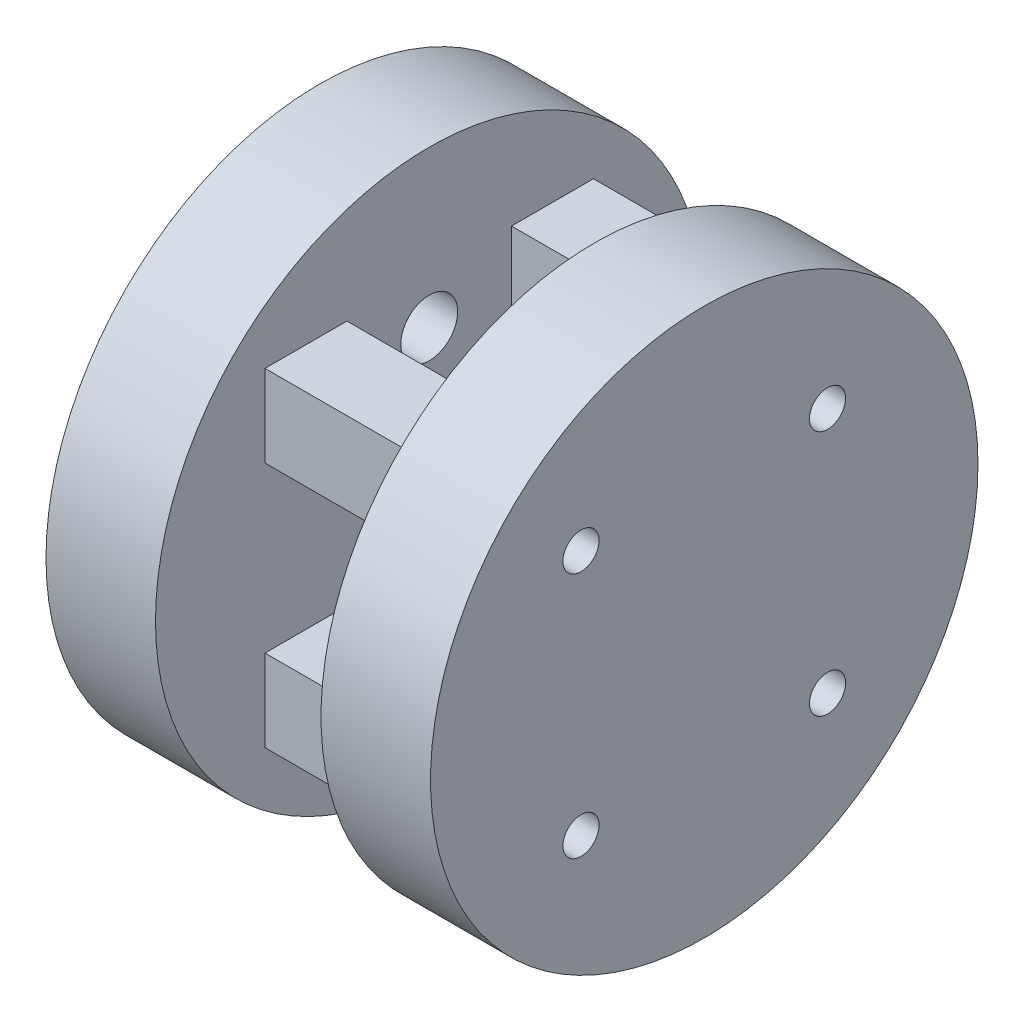
ISO-10303-21;
HEADER;
FILE_DESCRIPTION(('STEP AP214'),'2;1');
FILE_NAME('part.step','',(''),(''),'','','');
FILE_SCHEMA(('AUTOMOTIVE_DESIGN { 1 0 10303 214 1 1 1 1 }'));
ENDSEC;
DATA;
#1=APPLICATION_CONTEXT('core data for automotive mechanical design processes');
#2=APPLICATION_PROTOCOL_DEFINITION('international standard','automotive_design',2000,#1);
#3=PRODUCT_CONTEXT('',#1,'mechanical');
#4=PRODUCT('Part','Part','',(#3));
#5=PRODUCT_RELATED_PRODUCT_CATEGORY('part','',(#4));
#6=PRODUCT_DEFINITION_FORMATION('','',#4);
#7=PRODUCT_DEFINITION_CONTEXT('part definition',#1,'design');
#8=PRODUCT_DEFINITION('design','',#6,#7);
#9=PRODUCT_DEFINITION_SHAPE('','',#8);
#10=(LENGTH_UNIT() NAMED_UNIT(*) SI_UNIT(.MILLI.,.METRE.));
#11=(NAMED_UNIT(*) PLANE_ANGLE_UNIT() SI_UNIT($,.RADIAN.));
#12=(NAMED_UNIT(*) SI_UNIT($,.STERADIAN.) SOLID_ANGLE_UNIT());
#13=UNCERTAINTY_MEASURE_WITH_UNIT(LENGTH_MEASURE(1.E-05),#10,'distance_accuracy_value','');
#14=(GEOMETRIC_REPRESENTATION_CONTEXT(3) GLOBAL_UNCERTAINTY_ASSIGNED_CONTEXT((#13)) GLOBAL_UNIT_ASSIGNED_CONTEXT((#10,
#11,#12)) REPRESENTATION_CONTEXT('',''));
#15=CARTESIAN_POINT('',(0.,0.,0.));
#16=DIRECTION('',(0.,0.,1.));
#17=DIRECTION('',(1.,0.,0.));
#18=AXIS2_PLACEMENT_3D('',#15,#16,#17);
#19=CARTESIAN_POINT('',(35.12,0.,0.));
#20=DIRECTION('',(-1.,0.,0.));
#21=DIRECTION('',(0.,0.,1.));
#22=AXIS2_PLACEMENT_3D('',#19,#20,#21);
#23=CYLINDRICAL_SURFACE('',#22,25.);
#24=CARTESIAN_POINT('',(35.12,0.,0.));
#25=DIRECTION('',(1.,0.,0.));
#26=DIRECTION('',(0.,0.,-1.));
#27=AXIS2_PLACEMENT_3D('',#24,#25,#26);
#28=CIRCLE('',#27,25.);
#29=CARTESIAN_POINT('',(35.12,0.,-25.));
#30=VERTEX_POINT('',#29);
#31=EDGE_CURVE('E11',#30,#30,#28,.T.);
#32=ORIENTED_EDGE('',*,*,#31,.F.);
#33=EDGE_LOOP('',(#32));
#34=FACE_BOUND('',#33,.T.);
#35=CARTESIAN_POINT('',(25.12,0.,0.));
#36=DIRECTION('',(1.,0.,0.));
#37=DIRECTION('',(0.,0.,-1.));
#38=AXIS2_PLACEMENT_3D('',#35,#36,#37);
#39=CIRCLE('',#38,25.);
#40=CARTESIAN_POINT('',(25.12,0.,-25.));
#41=VERTEX_POINT('',#40);
#42=EDGE_CURVE('E62',#41,#41,#39,.T.);
#43=ORIENTED_EDGE('',*,*,#42,.T.);
#44=EDGE_LOOP('',(#43));
#45=FACE_BOUND('',#44,.T.);
#46=ADVANCED_FACE('F55',(#34,#45),#23,.T.);
#47=CARTESIAN_POINT('',(35.12,0.,0.));
#48=DIRECTION('',(1.,0.,0.));
#49=DIRECTION('',(0.,0.,-1.));
#50=AXIS2_PLACEMENT_3D('',#47,#48,#49);
#51=PLANE('',#50);
#52=CARTESIAN_POINT('',(35.12,11.258,-11.258));
#53=DIRECTION('',(1.,0.,0.));
#54=DIRECTION('',(0.,0.,-1.));
#55=AXIS2_PLACEMENT_3D('',#52,#53,#54);
#56=CIRCLE('',#55,1.65);
#57=CARTESIAN_POINT('',(35.12,11.258,-12.908));
#58=VERTEX_POINT('',#57);
#59=EDGE_CURVE('E133',#58,#58,#56,.T.);
#60=ORIENTED_EDGE('',*,*,#59,.F.);
#61=EDGE_LOOP('',(#60));
#62=FACE_BOUND('',#61,.T.);
#63=CARTESIAN_POINT('',(35.12,-11.258,11.258));
#64=DIRECTION('',(1.,0.,0.));
#65=DIRECTION('',(0.,0.,-1.));
#66=AXIS2_PLACEMENT_3D('',#63,#64,#65);
#67=CIRCLE('',#66,1.65);
#68=CARTESIAN_POINT('',(35.12,-11.258,9.608));
#69=VERTEX_POINT('',#68);
#70=EDGE_CURVE('E129',#69,#69,#67,.T.);
#71=ORIENTED_EDGE('',*,*,#70,.F.);
#72=EDGE_LOOP('',(#71));
#73=FACE_BOUND('',#72,.T.);
#74=CARTESIAN_POINT('',(35.12,11.258,11.258));
#75=DIRECTION('',(1.,0.,0.));
#76=DIRECTION('',(0.,0.,-1.));
#77=AXIS2_PLACEMENT_3D('',#74,#75,#76);
#78=CIRCLE('',#77,1.65);
#79=CARTESIAN_POINT('',(35.12,11.258,9.608));
#80=VERTEX_POINT('',#79);
#81=EDGE_CURVE('E127',#80,#80,#78,.T.);
#82=ORIENTED_EDGE('',*,*,#81,.F.);
#83=EDGE_LOOP('',(#82));
#84=FACE_BOUND('',#83,.T.);
#85=CARTESIAN_POINT('',(35.12,-11.258,-11.258));
#86=DIRECTION('',(1.,0.,0.));
#87=DIRECTION('',(0.,0.,-1.));
#88=AXIS2_PLACEMENT_3D('',#85,#86,#87);
#89=CIRCLE('',#88,1.65);
#90=CARTESIAN_POINT('',(35.12,-11.258,-12.908));
#91=VERTEX_POINT('',#90);
#92=EDGE_CURVE('E69',#91,#91,#89,.T.);
#93=ORIENTED_EDGE('',*,*,#92,.F.);
#94=EDGE_LOOP('',(#93));
#95=FACE_BOUND('',#94,.T.);
#96=ORIENTED_EDGE('',*,*,#31,.T.);
#97=EDGE_LOOP('',(#96));
#98=FACE_BOUND('',#97,.T.);
#99=ADVANCED_FACE('F100',(#62,#73,#84,#95,#98),#51,.T.);
#100=CARTESIAN_POINT('',(25.12,0.,0.));
#101=DIRECTION('',(1.,0.,0.));
#102=DIRECTION('',(0.,0.,-1.));
#103=AXIS2_PLACEMENT_3D('',#100,#101,#102);
#104=PLANE('',#103);
#105=CARTESIAN_POINT('',(25.12,11.258,-11.258));
#106=DIRECTION('',(1.,0.,0.));
#107=DIRECTION('',(0.,0.,-1.));
#108=AXIS2_PLACEMENT_3D('',#105,#106,#107);
#109=CIRCLE('',#108,1.65);
#110=CARTESIAN_POINT('',(25.12,11.258,-12.908));
#111=VERTEX_POINT('',#110);
#112=EDGE_CURVE('E58',#111,#111,#109,.T.);
#113=ORIENTED_EDGE('',*,*,#112,.T.);
#114=EDGE_LOOP('',(#113));
#115=FACE_BOUND('',#114,.T.);
#116=CARTESIAN_POINT('',(25.12,-11.258,11.258));
#117=DIRECTION('',(1.,0.,0.));
#118=DIRECTION('',(0.,0.,-1.));
#119=AXIS2_PLACEMENT_3D('',#116,#117,#118);
#120=CIRCLE('',#119,1.65);
#121=CARTESIAN_POINT('',(25.12,-11.258,9.608));
#122=VERTEX_POINT('',#121);
#123=EDGE_CURVE('E77',#122,#122,#120,.T.);
#124=ORIENTED_EDGE('',*,*,#123,.T.);
#125=EDGE_LOOP('',(#124));
#126=FACE_BOUND('',#125,.T.);
#127=CARTESIAN_POINT('',(25.12,11.258,11.258));
#128=DIRECTION('',(1.,0.,0.));
#129=DIRECTION('',(0.,0.,-1.));
#130=AXIS2_PLACEMENT_3D('',#127,#128,#129);
#131=CIRCLE('',#130,1.65);
#132=CARTESIAN_POINT('',(25.12,11.258,9.608));
#133=VERTEX_POINT('',#132);
#134=EDGE_CURVE('E75',#133,#133,#131,.T.);
#135=ORIENTED_EDGE('',*,*,#134,.T.);
#136=EDGE_LOOP('',(#135));
#137=FACE_BOUND('',#136,.T.);
#138=CARTESIAN_POINT('',(25.12,-11.258,-11.258));
#139=DIRECTION('',(1.,0.,0.));
#140=DIRECTION('',(0.,0.,-1.));
#141=AXIS2_PLACEMENT_3D('',#138,#139,#140);
#142=CIRCLE('',#141,1.65);
#143=CARTESIAN_POINT('',(25.12,-11.258,-12.908));
#144=VERTEX_POINT('',#143);
#145=EDGE_CURVE('E72',#144,#144,#142,.T.);
#146=ORIENTED_EDGE('',*,*,#145,.T.);
#147=EDGE_LOOP('',(#146));
#148=FACE_BOUND('',#147,.T.);
#149=ORIENTED_EDGE('',*,*,#42,.F.);
#150=EDGE_LOOP('',(#149));
#151=FACE_BOUND('',#150,.T.);
#152=ADVANCED_FACE('F84',(#115,#126,#137,#148,#151),#104,.F.);
#153=CARTESIAN_POINT('',(0.,-11.258,-11.258));
#154=DIRECTION('',(1.,0.,0.));
#155=DIRECTION('',(0.,0.,-1.));
#156=AXIS2_PLACEMENT_3D('',#153,#154,#155);
#157=CYLINDRICAL_SURFACE('',#156,1.65);
#158=ORIENTED_EDGE('',*,*,#92,.T.);
#159=EDGE_LOOP('',(#158));
#160=FACE_BOUND('',#159,.T.);
#161=ORIENTED_EDGE('',*,*,#145,.F.);
#162=EDGE_LOOP('',(#161));
#163=FACE_BOUND('',#162,.T.);
#164=ADVANCED_FACE('F112',(#160,#163),#157,.F.);
#165=CARTESIAN_POINT('',(0.,11.258,11.258));
#166=DIRECTION('',(1.,0.,0.));
#167=DIRECTION('',(0.,0.,-1.));
#168=AXIS2_PLACEMENT_3D('',#165,#166,#167);
#169=CYLINDRICAL_SURFACE('',#168,1.65);
#170=ORIENTED_EDGE('',*,*,#81,.T.);
#171=EDGE_LOOP('',(#170));
#172=FACE_BOUND('',#171,.T.);
#173=ORIENTED_EDGE('',*,*,#134,.F.);
#174=EDGE_LOOP('',(#173));
#175=FACE_BOUND('',#174,.T.);
#176=ADVANCED_FACE('F94',(#172,#175),#169,.F.);
#177=CARTESIAN_POINT('',(0.,-11.258,11.258));
#178=DIRECTION('',(1.,0.,0.));
#179=DIRECTION('',(0.,0.,-1.));
#180=AXIS2_PLACEMENT_3D('',#177,#178,#179);
#181=CYLINDRICAL_SURFACE('',#180,1.65);
#182=ORIENTED_EDGE('',*,*,#70,.T.);
#183=EDGE_LOOP('',(#182));
#184=FACE_BOUND('',#183,.T.);
#185=ORIENTED_EDGE('',*,*,#123,.F.);
#186=EDGE_LOOP('',(#185));
#187=FACE_BOUND('',#186,.T.);
#188=ADVANCED_FACE('F88',(#184,#187),#181,.F.);
#189=CARTESIAN_POINT('',(0.,11.258,-11.258));
#190=DIRECTION('',(1.,0.,0.));
#191=DIRECTION('',(0.,0.,-1.));
#192=AXIS2_PLACEMENT_3D('',#189,#190,#191);
#193=CYLINDRICAL_SURFACE('',#192,1.65);
#194=ORIENTED_EDGE('',*,*,#59,.T.);
#195=EDGE_LOOP('',(#194));
#196=FACE_BOUND('',#195,.T.);
#197=ORIENTED_EDGE('',*,*,#112,.F.);
#198=EDGE_LOOP('',(#197));
#199=FACE_BOUND('',#198,.T.);
#200=ADVANCED_FACE('F86',(#196,#199),#193,.F.);
#201=CLOSED_SHELL('',(#46,#99,#152,#164,#176,#188,#200));
#202=MANIFOLD_SOLID_BREP('B2',#201);
#203=CARTESIAN_POINT('',(10.,15.,-15.));
#204=DIRECTION('',(0.,0.,1.));
#205=DIRECTION('',(0.,-1.,0.));
#206=AXIS2_PLACEMENT_3D('',#203,#204,#205);
#207=PLANE('',#206);
#208=DIRECTION('',(-1.,0.,0.));
#209=VECTOR('',#208,1.);
#210=CARTESIAN_POINT('',(10.,-15.,-15.));
#211=LINE('',#210,#209);
#212=CARTESIAN_POINT('',(25.12,-15.,-15.));
#213=VERTEX_POINT('',#212);
#214=CARTESIAN_POINT('',(9.99999999999999,-15.,-15.));
#215=VERTEX_POINT('',#214);
#216=EDGE_CURVE('E296',#213,#215,#211,.T.);
#217=ORIENTED_EDGE('',*,*,#216,.T.);
#218=DIRECTION('',(0.,-1.,0.));
#219=VECTOR('',#218,1.);
#220=CARTESIAN_POINT('',(9.99999999999999,-15.,-15.));
#221=LINE('',#220,#219);
#222=CARTESIAN_POINT('',(9.99999999999999,-7.516,-15.));
#223=VERTEX_POINT('',#222);
#224=EDGE_CURVE('E326',#223,#215,#221,.T.);
#225=ORIENTED_EDGE('',*,*,#224,.F.);
#226=DIRECTION('',(-1.,0.,0.));
#227=VECTOR('',#226,1.);
#228=CARTESIAN_POINT('',(25.12,-7.516,-15.));
#229=LINE('',#228,#227);
#230=CARTESIAN_POINT('',(25.12,-7.516,-15.));
#231=VERTEX_POINT('',#230);
#232=EDGE_CURVE('E382',#231,#223,#229,.T.);
#233=ORIENTED_EDGE('',*,*,#232,.F.);
#234=DIRECTION('',(0.,1.,0.));
#235=VECTOR('',#234,1.);
#236=CARTESIAN_POINT('',(25.12,-15.,-15.));
#237=LINE('',#236,#235);
#238=EDGE_CURVE('E401',#213,#231,#237,.T.);
#239=ORIENTED_EDGE('',*,*,#238,.F.);
#240=EDGE_LOOP('',(#217,#225,#233,#239));
#241=FACE_BOUND('',#240,.T.);
#242=ADVANCED_FACE('F182',(#241),#207,.F.);
#243=CARTESIAN_POINT('',(10.,15.,15.));
#244=DIRECTION('',(0.,-1.,0.));
#245=DIRECTION('',(0.,0.,-1.));
#246=AXIS2_PLACEMENT_3D('',#243,#244,#245);
#247=PLANE('',#246);
#248=DIRECTION('',(-1.,0.,0.));
#249=VECTOR('',#248,1.);
#250=CARTESIAN_POINT('',(10.,15.,-15.));
#251=LINE('',#250,#249);
#252=CARTESIAN_POINT('',(25.12,15.,-15.));
#253=VERTEX_POINT('',#252);
#254=CARTESIAN_POINT('',(9.99999999999999,15.,-15.));
#255=VERTEX_POINT('',#254);
#256=EDGE_CURVE('E53',#253,#255,#251,.T.);
#257=ORIENTED_EDGE('',*,*,#256,.T.);
#258=DIRECTION('',(0.,0.,-1.));
#259=VECTOR('',#258,1.);
#260=CARTESIAN_POINT('',(9.99999999999999,15.,-15.));
#261=LINE('',#260,#259);
#262=CARTESIAN_POINT('',(9.99999999999999,15.,-7.516));
#263=VERTEX_POINT('',#262);
#264=EDGE_CURVE('E327',#263,#255,#261,.T.);
#265=ORIENTED_EDGE('',*,*,#264,.F.);
#266=DIRECTION('',(-1.,0.,0.));
#267=VECTOR('',#266,1.);
#268=CARTESIAN_POINT('',(25.12,15.,-7.516));
#269=LINE('',#268,#267);
#270=CARTESIAN_POINT('',(25.12,15.,-7.516));
#271=VERTEX_POINT('',#270);
#272=EDGE_CURVE('E361',#271,#263,#269,.T.);
#273=ORIENTED_EDGE('',*,*,#272,.F.);
#274=DIRECTION('',(0.,0.,1.));
#275=VECTOR('',#274,1.);
#276=CARTESIAN_POINT('',(25.12,15.,-15.));
#277=LINE('',#276,#275);
#278=EDGE_CURVE('E378',#253,#271,#277,.T.);
#279=ORIENTED_EDGE('',*,*,#278,.F.);
#280=EDGE_LOOP('',(#257,#265,#273,#279));
#281=FACE_BOUND('',#280,.T.);
#282=ADVANCED_FACE('F514',(#281),#247,.F.);
#283=CARTESIAN_POINT('',(10.,15.,15.));
#284=DIRECTION('',(0.,0.,-1.));
#285=DIRECTION('',(0.,1.,0.));
#286=AXIS2_PLACEMENT_3D('',#283,#284,#285);
#287=PLANE('',#286);
#288=DIRECTION('',(-1.,0.,0.));
#289=VECTOR('',#288,1.);
#290=CARTESIAN_POINT('',(10.,15.,15.));
#291=LINE('',#290,#289);
#292=CARTESIAN_POINT('',(25.12,15.,15.));
#293=VERTEX_POINT('',#292);
#294=CARTESIAN_POINT('',(9.99999999999999,15.,15.));
#295=VERTEX_POINT('',#294);
#296=EDGE_CURVE('E190',#293,#295,#291,.T.);
#297=ORIENTED_EDGE('',*,*,#296,.T.);
#298=DIRECTION('',(0.,1.,0.));
#299=VECTOR('',#298,1.);
#300=CARTESIAN_POINT('',(9.99999999999999,15.,15.));
#301=LINE('',#300,#299);
#302=CARTESIAN_POINT('',(9.99999999999999,7.516,15.));
#303=VERTEX_POINT('',#302);
#304=EDGE_CURVE('E294',#303,#295,#301,.T.);
#305=ORIENTED_EDGE('',*,*,#304,.F.);
#306=DIRECTION('',(-1.,0.,0.));
#307=VECTOR('',#306,1.);
#308=CARTESIAN_POINT('',(25.12,7.516,15.));
#309=LINE('',#308,#307);
#310=CARTESIAN_POINT('',(25.12,7.516,15.));
#311=VERTEX_POINT('',#310);
#312=EDGE_CURVE('E291',#311,#303,#309,.T.);
#313=ORIENTED_EDGE('',*,*,#312,.F.);
#314=DIRECTION('',(0.,-1.,0.));
#315=VECTOR('',#314,1.);
#316=CARTESIAN_POINT('',(25.12,15.,15.));
#317=LINE('',#316,#315);
#318=EDGE_CURVE('E278',#293,#311,#317,.T.);
#319=ORIENTED_EDGE('',*,*,#318,.F.);
#320=EDGE_LOOP('',(#297,#305,#313,#319));
#321=FACE_BOUND('',#320,.T.);
#322=ADVANCED_FACE('F292',(#321),#287,.F.);
#323=CARTESIAN_POINT('',(10.,-15.,15.));
#324=DIRECTION('',(0.,1.,0.));
#325=DIRECTION('',(0.,0.,1.));
#326=AXIS2_PLACEMENT_3D('',#323,#324,#325);
#327=PLANE('',#326);
#328=DIRECTION('',(-1.,0.,0.));
#329=VECTOR('',#328,1.);
#330=CARTESIAN_POINT('',(10.,-15.,15.));
#331=LINE('',#330,#329);
#332=CARTESIAN_POINT('',(25.12,-15.,15.));
#333=VERTEX_POINT('',#332);
#334=CARTESIAN_POINT('',(9.99999999999999,-15.,15.));
#335=VERTEX_POINT('',#334);
#336=EDGE_CURVE('E315',#333,#335,#331,.T.);
#337=ORIENTED_EDGE('',*,*,#336,.T.);
#338=DIRECTION('',(0.,0.,1.));
#339=VECTOR('',#338,1.);
#340=CARTESIAN_POINT('',(9.99999999999999,-15.,15.));
#341=LINE('',#340,#339);
#342=CARTESIAN_POINT('',(9.99999999999999,-15.,7.516));
#343=VERTEX_POINT('',#342);
#344=EDGE_CURVE('E340',#343,#335,#341,.T.);
#345=ORIENTED_EDGE('',*,*,#344,.F.);
#346=DIRECTION('',(-1.,0.,0.));
#347=VECTOR('',#346,1.);
#348=CARTESIAN_POINT('',(25.12,-15.,7.516));
#349=LINE('',#348,#347);
#350=CARTESIAN_POINT('',(25.12,-15.,7.516));
#351=VERTEX_POINT('',#350);
#352=EDGE_CURVE('E344',#351,#343,#349,.T.);
#353=ORIENTED_EDGE('',*,*,#352,.F.);
#354=DIRECTION('',(0.,0.,-1.));
#355=VECTOR('',#354,1.);
#356=CARTESIAN_POINT('',(25.12,-15.,15.));
#357=LINE('',#356,#355);
#358=EDGE_CURVE('E426',#333,#351,#357,.T.);
#359=ORIENTED_EDGE('',*,*,#358,.F.);
#360=EDGE_LOOP('',(#337,#345,#353,#359));
#361=FACE_BOUND('',#360,.T.);
#362=ADVANCED_FACE('F442',(#361),#327,.F.);
#363=DIRECTION('',(-1.,0.,0.));
#364=VECTOR('',#363,1.);
#365=CARTESIAN_POINT('',(25.12,7.516,-15.));
#366=LINE('',#365,#364);
#367=CARTESIAN_POINT('',(25.12,7.516,-15.));
#368=VERTEX_POINT('',#367);
#369=CARTESIAN_POINT('',(9.99999999999999,7.516,-15.));
#370=VERTEX_POINT('',#369);
#371=EDGE_CURVE('E368',#368,#370,#366,.T.);
#372=ORIENTED_EDGE('',*,*,#371,.T.);
#373=EDGE_CURVE('E329',#255,#370,#221,.T.);
#374=ORIENTED_EDGE('',*,*,#373,.F.);
#375=ORIENTED_EDGE('',*,*,#256,.F.);
#376=DIRECTION('',(0.,1.,0.));
#377=VECTOR('',#376,1.);
#378=CARTESIAN_POINT('',(25.12,7.516,-15.));
#379=LINE('',#378,#377);
#380=EDGE_CURVE('E373',#368,#253,#379,.T.);
#381=ORIENTED_EDGE('',*,*,#380,.F.);
#382=EDGE_LOOP('',(#372,#374,#375,#381));
#383=FACE_BOUND('',#382,.T.);
#384=ADVANCED_FACE('F184',(#383),#207,.F.);
#385=DIRECTION('',(-1.,0.,0.));
#386=VECTOR('',#385,1.);
#387=CARTESIAN_POINT('',(25.12,15.,7.516));
#388=LINE('',#387,#386);
#389=CARTESIAN_POINT('',(25.12,15.,7.516));
#390=VERTEX_POINT('',#389);
#391=CARTESIAN_POINT('',(9.99999999999999,15.,7.516));
#392=VERTEX_POINT('',#391);
#393=EDGE_CURVE('E302',#390,#392,#388,.T.);
#394=ORIENTED_EDGE('',*,*,#393,.T.);
#395=EDGE_CURVE('E324',#295,#392,#261,.T.);
#396=ORIENTED_EDGE('',*,*,#395,.F.);
#397=ORIENTED_EDGE('',*,*,#296,.F.);
#398=DIRECTION('',(0.,0.,1.));
#399=VECTOR('',#398,1.);
#400=CARTESIAN_POINT('',(25.12,15.,7.516));
#401=LINE('',#400,#399);
#402=EDGE_CURVE('E285',#390,#293,#401,.T.);
#403=ORIENTED_EDGE('',*,*,#402,.F.);
#404=EDGE_LOOP('',(#394,#396,#397,#403));
#405=FACE_BOUND('',#404,.T.);
#406=ADVANCED_FACE('F323',(#405),#247,.F.);
#407=DIRECTION('',(-1.,0.,0.));
#408=VECTOR('',#407,1.);
#409=CARTESIAN_POINT('',(25.12,-7.516,15.));
#410=LINE('',#409,#408);
#411=CARTESIAN_POINT('',(25.12,-7.516,15.));
#412=VERTEX_POINT('',#411);
#413=CARTESIAN_POINT('',(9.99999999999999,-7.516,15.));
#414=VERTEX_POINT('',#413);
#415=EDGE_CURVE('E411',#412,#414,#410,.T.);
#416=ORIENTED_EDGE('',*,*,#415,.T.);
#417=EDGE_CURVE('E335',#335,#414,#301,.T.);
#418=ORIENTED_EDGE('',*,*,#417,.F.);
#419=ORIENTED_EDGE('',*,*,#336,.F.);
#420=DIRECTION('',(0.,-1.,0.));
#421=VECTOR('',#420,1.);
#422=CARTESIAN_POINT('',(25.12,-7.516,15.));
#423=LINE('',#422,#421);
#424=EDGE_CURVE('E418',#412,#333,#423,.T.);
#425=ORIENTED_EDGE('',*,*,#424,.F.);
#426=EDGE_LOOP('',(#416,#418,#419,#425));
#427=FACE_BOUND('',#426,.T.);
#428=ADVANCED_FACE('F437',(#427),#287,.F.);
#429=DIRECTION('',(-1.,0.,0.));
#430=VECTOR('',#429,1.);
#431=CARTESIAN_POINT('',(25.12,-15.,-7.516));
#432=LINE('',#431,#430);
#433=CARTESIAN_POINT('',(25.12,-15.,-7.516));
#434=VERTEX_POINT('',#433);
#435=CARTESIAN_POINT('',(10.,-15.,-7.516));
#436=VERTEX_POINT('',#435);
#437=EDGE_CURVE('E389',#434,#436,#432,.T.);
#438=ORIENTED_EDGE('',*,*,#437,.T.);
#439=EDGE_CURVE('E197',#215,#436,#341,.T.);
#440=ORIENTED_EDGE('',*,*,#439,.F.);
#441=ORIENTED_EDGE('',*,*,#216,.F.);
#442=DIRECTION('',(0.,0.,-1.));
#443=VECTOR('',#442,1.);
#444=CARTESIAN_POINT('',(25.12,-15.,-7.516));
#445=LINE('',#444,#443);
#446=EDGE_CURVE('E395',#434,#213,#445,.T.);
#447=ORIENTED_EDGE('',*,*,#446,.F.);
#448=EDGE_LOOP('',(#438,#440,#441,#447));
#449=FACE_BOUND('',#448,.T.);
#450=ADVANCED_FACE('F498',(#449),#327,.F.);
#451=CARTESIAN_POINT('',(10.,0.,0.));
#452=DIRECTION('',(1.,0.,0.));
#453=DIRECTION('',(0.,0.,-1.));
#454=AXIS2_PLACEMENT_3D('',#451,#452,#453);
#455=PLANE('',#454);
#456=ORIENTED_EDGE('',*,*,#373,.T.);
#457=DIRECTION('',(0.,0.,-1.));
#458=VECTOR('',#457,1.);
#459=CARTESIAN_POINT('',(10.,7.516,-7.516));
#460=LINE('',#459,#458);
#461=CARTESIAN_POINT('',(10.,7.516,-7.516));
#462=VERTEX_POINT('',#461);
#463=EDGE_CURVE('E230',#462,#370,#460,.T.);
#464=ORIENTED_EDGE('',*,*,#463,.F.);
#465=DIRECTION('',(0.,-1.,0.));
#466=VECTOR('',#465,1.);
#467=CARTESIAN_POINT('',(10.,15.,-7.516));
#468=LINE('',#467,#466);
#469=EDGE_CURVE('E308',#263,#462,#468,.T.);
#470=ORIENTED_EDGE('',*,*,#469,.F.);
#471=ORIENTED_EDGE('',*,*,#264,.T.);
#472=EDGE_LOOP('',(#456,#464,#470,#471));
#473=FACE_BOUND('',#472,.T.);
#474=ORIENTED_EDGE('',*,*,#395,.T.);
#475=DIRECTION('',(0.,1.,0.));
#476=VECTOR('',#475,1.);
#477=CARTESIAN_POINT('',(10.,7.516,7.516));
#478=LINE('',#477,#476);
#479=CARTESIAN_POINT('',(10.,7.516,7.516));
#480=VERTEX_POINT('',#479);
#481=EDGE_CURVE('E219',#480,#392,#478,.T.);
#482=ORIENTED_EDGE('',*,*,#481,.F.);
#483=DIRECTION('',(0.,0.,-1.));
#484=VECTOR('',#483,1.);
#485=CARTESIAN_POINT('',(10.,7.516,15.));
#486=LINE('',#485,#484);
#487=EDGE_CURVE('E306',#303,#480,#486,.T.);
#488=ORIENTED_EDGE('',*,*,#487,.F.);
#489=ORIENTED_EDGE('',*,*,#304,.T.);
#490=EDGE_LOOP('',(#474,#482,#488,#489));
#491=FACE_BOUND('',#490,.T.);
#492=ORIENTED_EDGE('',*,*,#417,.T.);
#493=DIRECTION('',(0.,0.,1.));
#494=VECTOR('',#493,1.);
#495=CARTESIAN_POINT('',(10.,-7.516,7.516));
#496=LINE('',#495,#494);
#497=CARTESIAN_POINT('',(10.,-7.516,7.516));
#498=VERTEX_POINT('',#497);
#499=EDGE_CURVE('E415',#498,#414,#496,.T.);
#500=ORIENTED_EDGE('',*,*,#499,.F.);
#501=DIRECTION('',(0.,1.,0.));
#502=VECTOR('',#501,1.);
#503=CARTESIAN_POINT('',(10.,-15.,7.516));
#504=LINE('',#503,#502);
#505=EDGE_CURVE('E386',#343,#498,#504,.T.);
#506=ORIENTED_EDGE('',*,*,#505,.F.);
#507=ORIENTED_EDGE('',*,*,#344,.T.);
#508=EDGE_LOOP('',(#492,#500,#506,#507));
#509=FACE_BOUND('',#508,.T.);
#510=CARTESIAN_POINT('',(10.,10.7,0.));
#511=DIRECTION('',(1.,0.,0.));
#512=DIRECTION('',(0.,0.,-1.));
#513=AXIS2_PLACEMENT_3D('',#510,#511,#512);
#514=CIRCLE('',#513,2.59630787526163);
#515=CARTESIAN_POINT('',(10.,10.7,-2.59630787526163));
#516=VERTEX_POINT('',#515);
#517=EDGE_CURVE('E345',#516,#516,#514,.T.);
#518=ORIENTED_EDGE('',*,*,#517,.F.);
#519=EDGE_LOOP('',(#518));
#520=FACE_BOUND('',#519,.T.);
#521=CARTESIAN_POINT('',(10.,-10.7,0.));
#522=DIRECTION('',(1.,0.,0.));
#523=DIRECTION('',(0.,0.,-1.));
#524=AXIS2_PLACEMENT_3D('',#521,#522,#523);
#525=CIRCLE('',#524,2.59630787526163);
#526=CARTESIAN_POINT('',(10.,-10.7,-2.59630787526164));
#527=VERTEX_POINT('',#526);
#528=EDGE_CURVE('E348',#527,#527,#525,.T.);
#529=ORIENTED_EDGE('',*,*,#528,.F.);
#530=EDGE_LOOP('',(#529));
#531=FACE_BOUND('',#530,.T.);
#532=CARTESIAN_POINT('',(10.,0.,0.));
#533=DIRECTION('',(1.,0.,0.));
#534=DIRECTION('',(0.,0.,-1.));
#535=AXIS2_PLACEMENT_3D('',#532,#533,#534);
#536=CIRCLE('',#535,2.59630787526163);
#537=CARTESIAN_POINT('',(10.,0.,-2.59630787526163));
#538=VERTEX_POINT('',#537);
#539=EDGE_CURVE('E354',#538,#538,#536,.T.);
#540=ORIENTED_EDGE('',*,*,#539,.F.);
#541=EDGE_LOOP('',(#540));
#542=FACE_BOUND('',#541,.T.);
#543=DIRECTION('',(0.,0.,1.));
#544=VECTOR('',#543,1.);
#545=CARTESIAN_POINT('',(10.,-7.516,-15.));
#546=LINE('',#545,#544);
#547=CARTESIAN_POINT('',(10.,-7.516,-7.516));
#548=VERTEX_POINT('',#547);
#549=EDGE_CURVE('E365',#223,#548,#546,.T.);
#550=ORIENTED_EDGE('',*,*,#549,.F.);
#551=ORIENTED_EDGE('',*,*,#224,.T.);
#552=ORIENTED_EDGE('',*,*,#439,.T.);
#553=DIRECTION('',(0.,-1.,0.));
#554=VECTOR('',#553,1.);
#555=CARTESIAN_POINT('',(10.,-7.516,-7.516));
#556=LINE('',#555,#554);
#557=EDGE_CURVE('E393',#548,#436,#556,.T.);
#558=ORIENTED_EDGE('',*,*,#557,.F.);
#559=EDGE_LOOP('',(#550,#551,#552,#558));
#560=FACE_BOUND('',#559,.T.);
#561=CARTESIAN_POINT('',(9.99999999999999,0.,0.));
#562=DIRECTION('',(1.,0.,0.));
#563=DIRECTION('',(0.,0.,-1.));
#564=AXIS2_PLACEMENT_3D('',#561,#562,#563);
#565=CIRCLE('',#564,25.);
#566=CARTESIAN_POINT('',(9.99999999999999,0.,-25.));
#567=VERTEX_POINT('',#566);
#568=EDGE_CURVE('E732',#567,#567,#565,.F.);
#569=ORIENTED_EDGE('',*,*,#568,.F.);
#570=EDGE_LOOP('',(#569));
#571=FACE_BOUND('',#570,.T.);
#572=ADVANCED_FACE('F453',(#473,#491,#509,#520,#531,#542,#560,#571),#455,.T.);
#573=CARTESIAN_POINT('',(0.,0.,0.));
#574=DIRECTION('',(1.,0.,0.));
#575=DIRECTION('',(0.,0.,-1.));
#576=AXIS2_PLACEMENT_3D('',#573,#574,#575);
#577=PLANE('',#576);
#578=CARTESIAN_POINT('',(0.,10.7,0.));
#579=DIRECTION('',(1.,0.,0.));
#580=DIRECTION('',(0.,0.,-1.));
#581=AXIS2_PLACEMENT_3D('',#578,#579,#580);
#582=CIRCLE('',#581,2.59630787526163);
#583=CARTESIAN_POINT('',(0.,10.7,-2.59630787526163));
#584=VERTEX_POINT('',#583);
#585=EDGE_CURVE('E341',#584,#584,#582,.T.);
#586=ORIENTED_EDGE('',*,*,#585,.T.);
#587=EDGE_LOOP('',(#586));
#588=FACE_BOUND('',#587,.T.);
#589=CARTESIAN_POINT('',(0.,-10.7,0.));
#590=DIRECTION('',(1.,0.,0.));
#591=DIRECTION('',(0.,0.,-1.));
#592=AXIS2_PLACEMENT_3D('',#589,#590,#591);
#593=CIRCLE('',#592,2.59630787526163);
#594=CARTESIAN_POINT('',(0.,-10.7,-2.59630787526164));
#595=VERTEX_POINT('',#594);
#596=EDGE_CURVE('E351',#595,#595,#593,.T.);
#597=ORIENTED_EDGE('',*,*,#596,.T.);
#598=EDGE_LOOP('',(#597));
#599=FACE_BOUND('',#598,.T.);
#600=CARTESIAN_POINT('',(0.,0.,0.));
#601=DIRECTION('',(1.,0.,0.));
#602=DIRECTION('',(0.,0.,-1.));
#603=AXIS2_PLACEMENT_3D('',#600,#601,#602);
#604=CIRCLE('',#603,2.59630787526163);
#605=CARTESIAN_POINT('',(0.,0.,-2.59630787526163));
#606=VERTEX_POINT('',#605);
#607=EDGE_CURVE('E338',#606,#606,#604,.T.);
#608=ORIENTED_EDGE('',*,*,#607,.T.);
#609=EDGE_LOOP('',(#608));
#610=FACE_BOUND('',#609,.T.);
#611=CARTESIAN_POINT('',(0.,0.,0.));
#612=DIRECTION('',(-1.,0.,0.));
#613=DIRECTION('',(0.,0.,1.));
#614=AXIS2_PLACEMENT_3D('',#611,#612,#613);
#615=CIRCLE('',#614,25.);
#616=CARTESIAN_POINT('',(0.,0.,25.));
#617=VERTEX_POINT('',#616);
#618=EDGE_CURVE('E332',#617,#617,#615,.T.);
#619=ORIENTED_EDGE('',*,*,#618,.T.);
#620=EDGE_LOOP('',(#619));
#621=FACE_BOUND('',#620,.T.);
#622=ADVANCED_FACE('F536',(#588,#599,#610,#621),#577,.F.);
#623=CARTESIAN_POINT('',(25.12,7.516,15.));
#624=DIRECTION('',(0.,1.,0.));
#625=DIRECTION('',(0.,0.,1.));
#626=AXIS2_PLACEMENT_3D('',#623,#624,#625);
#627=PLANE('',#626);
#628=ORIENTED_EDGE('',*,*,#487,.T.);
#629=DIRECTION('',(-1.,0.,0.));
#630=VECTOR('',#629,1.);
#631=CARTESIAN_POINT('',(25.12,7.516,7.516));
#632=LINE('',#631,#630);
#633=CARTESIAN_POINT('',(25.12,7.516,7.516));
#634=VERTEX_POINT('',#633);
#635=EDGE_CURVE('E297',#634,#480,#632,.T.);
#636=ORIENTED_EDGE('',*,*,#635,.F.);
#637=DIRECTION('',(0.,0.,-1.));
#638=VECTOR('',#637,1.);
#639=CARTESIAN_POINT('',(25.12,7.516,15.));
#640=LINE('',#639,#638);
#641=EDGE_CURVE('E282',#311,#634,#640,.T.);
#642=ORIENTED_EDGE('',*,*,#641,.F.);
#643=ORIENTED_EDGE('',*,*,#312,.T.);
#644=EDGE_LOOP('',(#628,#636,#642,#643));
#645=FACE_BOUND('',#644,.T.);
#646=ADVANCED_FACE('F299',(#645),#627,.F.);
#647=CARTESIAN_POINT('',(25.12,7.516,7.516));
#648=DIRECTION('',(0.,0.,1.));
#649=DIRECTION('',(0.,-1.,0.));
#650=AXIS2_PLACEMENT_3D('',#647,#648,#649);
#651=PLANE('',#650);
#652=ORIENTED_EDGE('',*,*,#481,.T.);
#653=ORIENTED_EDGE('',*,*,#393,.F.);
#654=DIRECTION('',(0.,1.,0.));
#655=VECTOR('',#654,1.);
#656=CARTESIAN_POINT('',(25.12,7.516,7.516));
#657=LINE('',#656,#655);
#658=EDGE_CURVE('E206',#634,#390,#657,.T.);
#659=ORIENTED_EDGE('',*,*,#658,.F.);
#660=ORIENTED_EDGE('',*,*,#635,.T.);
#661=EDGE_LOOP('',(#652,#653,#659,#660));
#662=FACE_BOUND('',#661,.T.);
#663=ADVANCED_FACE('F762',(#662),#651,.F.);
#664=CARTESIAN_POINT('',(25.12,0.,0.));
#665=DIRECTION('',(1.,0.,0.));
#666=DIRECTION('',(0.,0.,-1.));
#667=AXIS2_PLACEMENT_3D('',#664,#665,#666);
#668=PLANE('',#667);
#669=CARTESIAN_POINT('',(25.12,11.258,11.258));
#670=DIRECTION('',(1.,0.,0.));
#671=DIRECTION('',(0.,0.,-1.));
#672=AXIS2_PLACEMENT_3D('',#669,#670,#671);
#673=CIRCLE('',#672,1.45);
#674=CARTESIAN_POINT('',(25.12,11.258,9.808));
#675=VERTEX_POINT('',#674);
#676=EDGE_CURVE('E737',#675,#675,#673,.T.);
#677=ORIENTED_EDGE('',*,*,#676,.F.);
#678=EDGE_LOOP('',(#677));
#679=FACE_BOUND('',#678,.T.);
#680=ORIENTED_EDGE('',*,*,#402,.T.);
#681=ORIENTED_EDGE('',*,*,#318,.T.);
#682=ORIENTED_EDGE('',*,*,#641,.T.);
#683=ORIENTED_EDGE('',*,*,#658,.T.);
#684=EDGE_LOOP('',(#680,#681,#682,#683));
#685=FACE_BOUND('',#684,.T.);
#686=ADVANCED_FACE('F280',(#679,#685),#668,.T.);
#687=CARTESIAN_POINT('',(25.12,15.,-7.516));
#688=DIRECTION('',(0.,0.,-1.));
#689=DIRECTION('',(-1.,0.,0.));
#690=AXIS2_PLACEMENT_3D('',#687,#688,#689);
#691=PLANE('',#690);
#692=ORIENTED_EDGE('',*,*,#469,.T.);
#693=DIRECTION('',(-1.,0.,0.));
#694=VECTOR('',#693,1.);
#695=CARTESIAN_POINT('',(25.12,7.516,-7.516));
#696=LINE('',#695,#694);
#697=CARTESIAN_POINT('',(25.12,7.516,-7.516));
#698=VERTEX_POINT('',#697);
#699=EDGE_CURVE('E364',#698,#462,#696,.T.);
#700=ORIENTED_EDGE('',*,*,#699,.F.);
#701=DIRECTION('',(0.,-1.,0.));
#702=VECTOR('',#701,1.);
#703=CARTESIAN_POINT('',(25.12,15.,-7.516));
#704=LINE('',#703,#702);
#705=EDGE_CURVE('E376',#271,#698,#704,.T.);
#706=ORIENTED_EDGE('',*,*,#705,.F.);
#707=ORIENTED_EDGE('',*,*,#272,.T.);
#708=EDGE_LOOP('',(#692,#700,#706,#707));
#709=FACE_BOUND('',#708,.T.);
#710=ADVANCED_FACE('F476',(#709),#691,.F.);
#711=CARTESIAN_POINT('',(25.12,7.516,-7.516));
#712=DIRECTION('',(0.,1.,0.));
#713=DIRECTION('',(0.,0.,1.));
#714=AXIS2_PLACEMENT_3D('',#711,#712,#713);
#715=PLANE('',#714);
#716=ORIENTED_EDGE('',*,*,#463,.T.);
#717=ORIENTED_EDGE('',*,*,#371,.F.);
#718=DIRECTION('',(0.,0.,-1.));
#719=VECTOR('',#718,1.);
#720=CARTESIAN_POINT('',(25.12,7.516,-7.516));
#721=LINE('',#720,#719);
#722=EDGE_CURVE('E371',#698,#368,#721,.T.);
#723=ORIENTED_EDGE('',*,*,#722,.F.);
#724=ORIENTED_EDGE('',*,*,#699,.T.);
#725=EDGE_LOOP('',(#716,#717,#723,#724));
#726=FACE_BOUND('',#725,.T.);
#727=ADVANCED_FACE('F466',(#726),#715,.F.);
#728=CARTESIAN_POINT('',(25.12,0.,0.));
#729=DIRECTION('',(1.,0.,0.));
#730=DIRECTION('',(0.,0.,-1.));
#731=AXIS2_PLACEMENT_3D('',#728,#729,#730);
#732=PLANE('',#731);
#733=CARTESIAN_POINT('',(25.12,11.258,-11.258));
#734=DIRECTION('',(1.,0.,0.));
#735=DIRECTION('',(0.,0.,-1.));
#736=AXIS2_PLACEMENT_3D('',#733,#734,#735);
#737=CIRCLE('',#736,1.45);
#738=CARTESIAN_POINT('',(25.12,11.258,-12.708));
#739=VERTEX_POINT('',#738);
#740=EDGE_CURVE('E719',#739,#739,#737,.T.);
#741=ORIENTED_EDGE('',*,*,#740,.F.);
#742=EDGE_LOOP('',(#741));
#743=FACE_BOUND('',#742,.T.);
#744=ORIENTED_EDGE('',*,*,#380,.T.);
#745=ORIENTED_EDGE('',*,*,#278,.T.);
#746=ORIENTED_EDGE('',*,*,#705,.T.);
#747=ORIENTED_EDGE('',*,*,#722,.T.);
#748=EDGE_LOOP('',(#744,#745,#746,#747));
#749=FACE_BOUND('',#748,.T.);
#750=ADVANCED_FACE('F472',(#743,#749),#732,.T.);
#751=CARTESIAN_POINT('',(25.12,-7.516,-15.));
#752=DIRECTION('',(0.,-1.,0.));
#753=DIRECTION('',(0.,0.,-1.));
#754=AXIS2_PLACEMENT_3D('',#751,#752,#753);
#755=PLANE('',#754);
#756=ORIENTED_EDGE('',*,*,#549,.T.);
#757=DIRECTION('',(-1.,0.,0.));
#758=VECTOR('',#757,1.);
#759=CARTESIAN_POINT('',(25.12,-7.516,-7.516));
#760=LINE('',#759,#758);
#761=CARTESIAN_POINT('',(25.12,-7.516,-7.516));
#762=VERTEX_POINT('',#761);
#763=EDGE_CURVE('E385',#762,#548,#760,.T.);
#764=ORIENTED_EDGE('',*,*,#763,.F.);
#765=DIRECTION('',(0.,0.,1.));
#766=VECTOR('',#765,1.);
#767=CARTESIAN_POINT('',(25.12,-7.516,-15.));
#768=LINE('',#767,#766);
#769=EDGE_CURVE('E399',#231,#762,#768,.T.);
#770=ORIENTED_EDGE('',*,*,#769,.F.);
#771=ORIENTED_EDGE('',*,*,#232,.T.);
#772=EDGE_LOOP('',(#756,#764,#770,#771));
#773=FACE_BOUND('',#772,.T.);
#774=ADVANCED_FACE('F491',(#773),#755,.F.);
#775=CARTESIAN_POINT('',(25.12,-7.516,-7.516));
#776=DIRECTION('',(0.,0.,-1.));
#777=DIRECTION('',(-1.,0.,0.));
#778=AXIS2_PLACEMENT_3D('',#775,#776,#777);
#779=PLANE('',#778);
#780=ORIENTED_EDGE('',*,*,#557,.T.);
#781=ORIENTED_EDGE('',*,*,#437,.F.);
#782=DIRECTION('',(0.,-1.,0.));
#783=VECTOR('',#782,1.);
#784=CARTESIAN_POINT('',(25.12,-7.516,-7.516));
#785=LINE('',#784,#783);
#786=EDGE_CURVE('E392',#762,#434,#785,.T.);
#787=ORIENTED_EDGE('',*,*,#786,.F.);
#788=ORIENTED_EDGE('',*,*,#763,.T.);
#789=EDGE_LOOP('',(#780,#781,#787,#788));
#790=FACE_BOUND('',#789,.T.);
#791=ADVANCED_FACE('F502',(#790),#779,.F.);
#792=CARTESIAN_POINT('',(25.12,0.,0.));
#793=DIRECTION('',(1.,0.,0.));
#794=DIRECTION('',(0.,0.,-1.));
#795=AXIS2_PLACEMENT_3D('',#792,#793,#794);
#796=PLANE('',#795);
#797=CARTESIAN_POINT('',(25.12,-11.258,-11.258));
#798=DIRECTION('',(1.,0.,0.));
#799=DIRECTION('',(0.,0.,-1.));
#800=AXIS2_PLACEMENT_3D('',#797,#798,#799);
#801=CIRCLE('',#800,1.45);
#802=CARTESIAN_POINT('',(25.12,-11.258,-12.708));
#803=VERTEX_POINT('',#802);
#804=EDGE_CURVE('E725',#803,#803,#801,.T.);
#805=ORIENTED_EDGE('',*,*,#804,.F.);
#806=EDGE_LOOP('',(#805));
#807=FACE_BOUND('',#806,.T.);
#808=ORIENTED_EDGE('',*,*,#446,.T.);
#809=ORIENTED_EDGE('',*,*,#238,.T.);
#810=ORIENTED_EDGE('',*,*,#769,.T.);
#811=ORIENTED_EDGE('',*,*,#786,.T.);
#812=EDGE_LOOP('',(#808,#809,#810,#811));
#813=FACE_BOUND('',#812,.T.);
#814=ADVANCED_FACE('F494',(#807,#813),#796,.T.);
#815=CARTESIAN_POINT('',(25.12,-15.,7.516));
#816=DIRECTION('',(0.,0.,1.));
#817=DIRECTION('',(1.,0.,0.));
#818=AXIS2_PLACEMENT_3D('',#815,#816,#817);
#819=PLANE('',#818);
#820=ORIENTED_EDGE('',*,*,#505,.T.);
#821=DIRECTION('',(-1.,0.,0.));
#822=VECTOR('',#821,1.);
#823=CARTESIAN_POINT('',(25.12,-7.516,7.516));
#824=LINE('',#823,#822);
#825=CARTESIAN_POINT('',(25.12,-7.516,7.516));
#826=VERTEX_POINT('',#825);
#827=EDGE_CURVE('E407',#826,#498,#824,.T.);
#828=ORIENTED_EDGE('',*,*,#827,.F.);
#829=DIRECTION('',(0.,1.,0.));
#830=VECTOR('',#829,1.);
#831=CARTESIAN_POINT('',(25.12,-15.,7.516));
#832=LINE('',#831,#830);
#833=EDGE_CURVE('E423',#351,#826,#832,.T.);
#834=ORIENTED_EDGE('',*,*,#833,.F.);
#835=ORIENTED_EDGE('',*,*,#352,.T.);
#836=EDGE_LOOP('',(#820,#828,#834,#835));
#837=FACE_BOUND('',#836,.T.);
#838=ADVANCED_FACE('F449',(#837),#819,.F.);
#839=CARTESIAN_POINT('',(25.12,-7.516,7.516));
#840=DIRECTION('',(0.,-1.,0.));
#841=DIRECTION('',(0.,0.,-1.));
#842=AXIS2_PLACEMENT_3D('',#839,#840,#841);
#843=PLANE('',#842);
#844=ORIENTED_EDGE('',*,*,#499,.T.);
#845=ORIENTED_EDGE('',*,*,#415,.F.);
#846=DIRECTION('',(0.,0.,1.));
#847=VECTOR('',#846,1.);
#848=CARTESIAN_POINT('',(25.12,-7.516,7.516));
#849=LINE('',#848,#847);
#850=EDGE_CURVE('E414',#826,#412,#849,.T.);
#851=ORIENTED_EDGE('',*,*,#850,.F.);
#852=ORIENTED_EDGE('',*,*,#827,.T.);
#853=EDGE_LOOP('',(#844,#845,#851,#852));
#854=FACE_BOUND('',#853,.T.);
#855=ADVANCED_FACE('F451',(#854),#843,.F.);
#856=CARTESIAN_POINT('',(25.12,0.,0.));
#857=DIRECTION('',(1.,0.,0.));
#858=DIRECTION('',(0.,0.,-1.));
#859=AXIS2_PLACEMENT_3D('',#856,#857,#858);
#860=PLANE('',#859);
#861=CARTESIAN_POINT('',(25.12,-11.258,11.258));
#862=DIRECTION('',(1.,0.,0.));
#863=DIRECTION('',(0.,0.,-1.));
#864=AXIS2_PLACEMENT_3D('',#861,#862,#863);
#865=CIRCLE('',#864,1.45);
#866=CARTESIAN_POINT('',(25.12,-11.258,9.808));
#867=VERTEX_POINT('',#866);
#868=EDGE_CURVE('E741',#867,#867,#865,.T.);
#869=ORIENTED_EDGE('',*,*,#868,.F.);
#870=EDGE_LOOP('',(#869));
#871=FACE_BOUND('',#870,.T.);
#872=ORIENTED_EDGE('',*,*,#424,.T.);
#873=ORIENTED_EDGE('',*,*,#358,.T.);
#874=ORIENTED_EDGE('',*,*,#833,.T.);
#875=ORIENTED_EDGE('',*,*,#850,.T.);
#876=EDGE_LOOP('',(#872,#873,#874,#875));
#877=FACE_BOUND('',#876,.T.);
#878=ADVANCED_FACE('F431',(#871,#877),#860,.T.);
#879=CARTESIAN_POINT('',(0.,0.,0.));
#880=DIRECTION('',(1.,0.,0.));
#881=DIRECTION('',(0.,0.,-1.));
#882=AXIS2_PLACEMENT_3D('',#879,#880,#881);
#883=CYLINDRICAL_SURFACE('',#882,2.59630787526163);
#884=ORIENTED_EDGE('',*,*,#607,.F.);
#885=EDGE_LOOP('',(#884));
#886=FACE_BOUND('',#885,.T.);
#887=ORIENTED_EDGE('',*,*,#539,.T.);
#888=EDGE_LOOP('',(#887));
#889=FACE_BOUND('',#888,.T.);
#890=ADVANCED_FACE('F704',(#886,#889),#883,.F.);
#891=CARTESIAN_POINT('',(0.,-10.7,0.));
#892=DIRECTION('',(1.,0.,0.));
#893=DIRECTION('',(0.,0.,-1.));
#894=AXIS2_PLACEMENT_3D('',#891,#892,#893);
#895=CYLINDRICAL_SURFACE('',#894,2.59630787526163);
#896=ORIENTED_EDGE('',*,*,#596,.F.);
#897=EDGE_LOOP('',(#896));
#898=FACE_BOUND('',#897,.T.);
#899=ORIENTED_EDGE('',*,*,#528,.T.);
#900=EDGE_LOOP('',(#899));
#901=FACE_BOUND('',#900,.T.);
#902=ADVANCED_FACE('F700',(#898,#901),#895,.F.);
#903=CARTESIAN_POINT('',(0.,10.7,0.));
#904=DIRECTION('',(1.,0.,0.));
#905=DIRECTION('',(0.,0.,-1.));
#906=AXIS2_PLACEMENT_3D('',#903,#904,#905);
#907=CYLINDRICAL_SURFACE('',#906,2.59630787526163);
#908=ORIENTED_EDGE('',*,*,#585,.F.);
#909=EDGE_LOOP('',(#908));
#910=FACE_BOUND('',#909,.T.);
#911=ORIENTED_EDGE('',*,*,#517,.T.);
#912=EDGE_LOOP('',(#911));
#913=FACE_BOUND('',#912,.T.);
#914=ADVANCED_FACE('F611',(#910,#913),#907,.F.);
#915=CARTESIAN_POINT('',(80.7106781186548,0.,0.));
#916=DIRECTION('',(-1.,0.,0.));
#917=DIRECTION('',(0.,0.,1.));
#918=AXIS2_PLACEMENT_3D('',#915,#916,#917);
#919=CYLINDRICAL_SURFACE('',#918,25.);
#920=ORIENTED_EDGE('',*,*,#618,.F.);
#921=EDGE_LOOP('',(#920));
#922=FACE_BOUND('',#921,.T.);
#923=ORIENTED_EDGE('',*,*,#568,.T.);
#924=EDGE_LOOP('',(#923));
#925=FACE_BOUND('',#924,.T.);
#926=ADVANCED_FACE('F604',(#922,#925),#919,.T.);
#927=CARTESIAN_POINT('',(15.12,-11.258,11.258));
#928=DIRECTION('',(1.,0.,0.));
#929=DIRECTION('',(0.,0.,-1.));
#930=AXIS2_PLACEMENT_3D('',#927,#928,#929);
#931=CYLINDRICAL_SURFACE('',#930,1.45);
#932=CARTESIAN_POINT('',(15.12,-11.258,11.258));
#933=DIRECTION('',(1.,0.,0.));
#934=DIRECTION('',(0.,0.,-1.));
#935=AXIS2_PLACEMENT_3D('',#932,#933,#934);
#936=CIRCLE('',#935,1.45);
#937=CARTESIAN_POINT('',(15.12,-11.258,9.808));
#938=VERTEX_POINT('',#937);
#939=EDGE_CURVE('E746',#938,#938,#936,.T.);
#940=ORIENTED_EDGE('',*,*,#939,.F.);
#941=EDGE_LOOP('',(#940));
#942=FACE_BOUND('',#941,.T.);
#943=ORIENTED_EDGE('',*,*,#868,.T.);
#944=EDGE_LOOP('',(#943));
#945=FACE_BOUND('',#944,.T.);
#946=ADVANCED_FACE('F610',(#942,#945),#931,.F.);
#947=CARTESIAN_POINT('',(15.12,-11.258,11.258));
#948=DIRECTION('',(1.,0.,0.));
#949=DIRECTION('',(0.,0.,-1.));
#950=AXIS2_PLACEMENT_3D('',#947,#948,#949);
#951=PLANE('',#950);
#952=ORIENTED_EDGE('',*,*,#939,.T.);
#953=EDGE_LOOP('',(#952));
#954=FACE_BOUND('',#953,.T.);
#955=ADVANCED_FACE('F623',(#954),#951,.T.);
#956=CARTESIAN_POINT('',(15.12,-11.258,-11.258));
#957=DIRECTION('',(1.,0.,0.));
#958=DIRECTION('',(0.,0.,-1.));
#959=AXIS2_PLACEMENT_3D('',#956,#957,#958);
#960=CYLINDRICAL_SURFACE('',#959,1.45);
#961=CARTESIAN_POINT('',(15.12,-11.258,-11.258));
#962=DIRECTION('',(1.,0.,0.));
#963=DIRECTION('',(0.,0.,-1.));
#964=AXIS2_PLACEMENT_3D('',#961,#962,#963);
#965=CIRCLE('',#964,1.45);
#966=CARTESIAN_POINT('',(15.12,-11.258,-12.708));
#967=VERTEX_POINT('',#966);
#968=EDGE_CURVE('E721',#967,#967,#965,.T.);
#969=ORIENTED_EDGE('',*,*,#968,.F.);
#970=EDGE_LOOP('',(#969));
#971=FACE_BOUND('',#970,.T.);
#972=ORIENTED_EDGE('',*,*,#804,.T.);
#973=EDGE_LOOP('',(#972));
#974=FACE_BOUND('',#973,.T.);
#975=ADVANCED_FACE('F634',(#971,#974),#960,.F.);
#976=CARTESIAN_POINT('',(15.12,-11.258,-11.258));
#977=DIRECTION('',(1.,0.,0.));
#978=DIRECTION('',(0.,0.,-1.));
#979=AXIS2_PLACEMENT_3D('',#976,#977,#978);
#980=PLANE('',#979);
#981=ORIENTED_EDGE('',*,*,#968,.T.);
#982=EDGE_LOOP('',(#981));
#983=FACE_BOUND('',#982,.T.);
#984=ADVANCED_FACE('F644',(#983),#980,.T.);
#985=CARTESIAN_POINT('',(15.12,11.258,-11.258));
#986=DIRECTION('',(1.,0.,0.));
#987=DIRECTION('',(0.,0.,-1.));
#988=AXIS2_PLACEMENT_3D('',#985,#986,#987);
#989=CYLINDRICAL_SURFACE('',#988,1.45);
#990=CARTESIAN_POINT('',(15.12,11.258,-11.258));
#991=DIRECTION('',(1.,0.,0.));
#992=DIRECTION('',(0.,0.,-1.));
#993=AXIS2_PLACEMENT_3D('',#990,#991,#992);
#994=CIRCLE('',#993,1.45);
#995=CARTESIAN_POINT('',(15.12,11.258,-12.708));
#996=VERTEX_POINT('',#995);
#997=EDGE_CURVE('E722',#996,#996,#994,.T.);
#998=ORIENTED_EDGE('',*,*,#997,.F.);
#999=EDGE_LOOP('',(#998));
#1000=FACE_BOUND('',#999,.T.);
#1001=ORIENTED_EDGE('',*,*,#740,.T.);
#1002=EDGE_LOOP('',(#1001));
#1003=FACE_BOUND('',#1002,.T.);
#1004=ADVANCED_FACE('F654',(#1000,#1003),#989,.F.);
#1005=CARTESIAN_POINT('',(15.12,11.258,-11.258));
#1006=DIRECTION('',(1.,0.,0.));
#1007=DIRECTION('',(0.,0.,-1.));
#1008=AXIS2_PLACEMENT_3D('',#1005,#1006,#1007);
#1009=PLANE('',#1008);
#1010=ORIENTED_EDGE('',*,*,#997,.T.);
#1011=EDGE_LOOP('',(#1010));
#1012=FACE_BOUND('',#1011,.T.);
#1013=ADVANCED_FACE('F664',(#1012),#1009,.T.);
#1014=CARTESIAN_POINT('',(15.12,11.258,11.258));
#1015=DIRECTION('',(1.,0.,0.));
#1016=DIRECTION('',(0.,0.,-1.));
#1017=AXIS2_PLACEMENT_3D('',#1014,#1015,#1016);
#1018=CYLINDRICAL_SURFACE('',#1017,1.45);
#1019=CARTESIAN_POINT('',(15.12,11.258,11.258));
#1020=DIRECTION('',(1.,0.,0.));
#1021=DIRECTION('',(0.,0.,-1.));
#1022=AXIS2_PLACEMENT_3D('',#1019,#1020,#1021);
#1023=CIRCLE('',#1022,1.45);
#1024=CARTESIAN_POINT('',(15.12,11.258,9.808));
#1025=VERTEX_POINT('',#1024);
#1026=EDGE_CURVE('E734',#1025,#1025,#1023,.T.);
#1027=ORIENTED_EDGE('',*,*,#1026,.F.);
#1028=EDGE_LOOP('',(#1027));
#1029=FACE_BOUND('',#1028,.T.);
#1030=ORIENTED_EDGE('',*,*,#676,.T.);
#1031=EDGE_LOOP('',(#1030));
#1032=FACE_BOUND('',#1031,.T.);
#1033=ADVANCED_FACE('F674',(#1029,#1032),#1018,.F.);
#1034=CARTESIAN_POINT('',(15.12,11.258,11.258));
#1035=DIRECTION('',(1.,0.,0.));
#1036=DIRECTION('',(0.,0.,-1.));
#1037=AXIS2_PLACEMENT_3D('',#1034,#1035,#1036);
#1038=PLANE('',#1037);
#1039=ORIENTED_EDGE('',*,*,#1026,.T.);
#1040=EDGE_LOOP('',(#1039));
#1041=FACE_BOUND('',#1040,.T.);
#1042=ADVANCED_FACE('F684',(#1041),#1038,.T.);
#1043=CLOSED_SHELL('',(#242,#282,#322,#362,#384,#406,#428,#450,#572,#622,#646,#663,#686,#710,
#727,#750,#774,#791,#814,#838,#855,#878,#890,#902,#914,#926,#946,#955,#975,#984,#1004,#1013,
#1033,#1042));
#1044=MANIFOLD_SOLID_BREP('B6',#1043);
#1045=ADVANCED_BREP_SHAPE_REPRESENTATION('',(#18,#202,#1044),#14);
#1046=SHAPE_DEFINITION_REPRESENTATION(#9,#1045);
ENDSEC;
END-ISO-10303-21;
